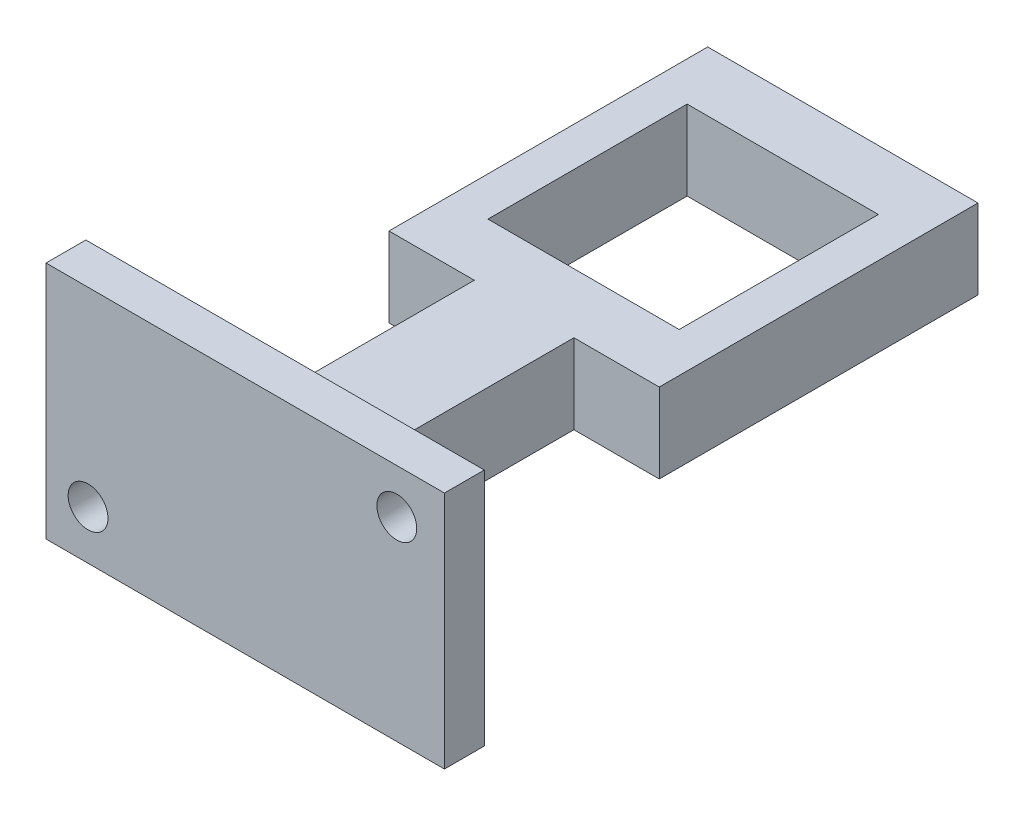
ISO-10303-21;
HEADER;
FILE_DESCRIPTION(('STEP AP214'),'2;1');
FILE_NAME('part.step','',(''),(''),'','','');
FILE_SCHEMA(('AUTOMOTIVE_DESIGN { 1 0 10303 214 1 1 1 1 }'));
ENDSEC;
DATA;
#1=APPLICATION_CONTEXT('core data for automotive mechanical design processes');
#2=APPLICATION_PROTOCOL_DEFINITION('international standard','automotive_design',2000,#1);
#3=PRODUCT_CONTEXT('',#1,'mechanical');
#4=PRODUCT('Part','Part','',(#3));
#5=PRODUCT_RELATED_PRODUCT_CATEGORY('part','',(#4));
#6=PRODUCT_DEFINITION_FORMATION('','',#4);
#7=PRODUCT_DEFINITION_CONTEXT('part definition',#1,'design');
#8=PRODUCT_DEFINITION('design','',#6,#7);
#9=PRODUCT_DEFINITION_SHAPE('','',#8);
#10=(LENGTH_UNIT() NAMED_UNIT(*) SI_UNIT(.MILLI.,.METRE.));
#11=(NAMED_UNIT(*) PLANE_ANGLE_UNIT() SI_UNIT($,.RADIAN.));
#12=(NAMED_UNIT(*) SI_UNIT($,.STERADIAN.) SOLID_ANGLE_UNIT());
#13=UNCERTAINTY_MEASURE_WITH_UNIT(LENGTH_MEASURE(1.E-05),#10,'distance_accuracy_value','');
#14=(GEOMETRIC_REPRESENTATION_CONTEXT(3) GLOBAL_UNCERTAINTY_ASSIGNED_CONTEXT((#13)) GLOBAL_UNIT_ASSIGNED_CONTEXT((#10,
#11,#12)) REPRESENTATION_CONTEXT('',''));
#15=CARTESIAN_POINT('',(0.,0.,0.));
#16=DIRECTION('',(0.,0.,1.));
#17=DIRECTION('',(1.,0.,0.));
#18=AXIS2_PLACEMENT_3D('',#15,#16,#17);
#19=CARTESIAN_POINT('',(0.,0.,0.));
#20=DIRECTION('',(0.,0.,-1.));
#21=DIRECTION('',(-1.,0.,0.));
#22=AXIS2_PLACEMENT_3D('',#19,#20,#21);
#23=PLANE('',#22);
#24=CARTESIAN_POINT('',(-19.7204584602484,-8.86343010030321,0.));
#25=DIRECTION('',(0.,0.,-1.));
#26=DIRECTION('',(-1.,0.,0.));
#27=AXIS2_PLACEMENT_3D('',#24,#25,#26);
#28=CIRCLE('',#27,2.5);
#29=CARTESIAN_POINT('',(-22.2204584602484,-8.86343010030321,0.));
#30=VERTEX_POINT('',#29);
#31=EDGE_CURVE('E287',#30,#30,#28,.T.);
#32=ORIENTED_EDGE('',*,*,#31,.F.);
#33=EDGE_LOOP('',(#32));
#34=FACE_BOUND('',#33,.T.);
#35=CARTESIAN_POINT('',(19.0200050176713,9.40224044074657,0.));
#36=DIRECTION('',(0.,0.,-1.));
#37=DIRECTION('',(-1.,0.,0.));
#38=AXIS2_PLACEMENT_3D('',#35,#36,#37);
#39=CIRCLE('',#38,2.5);
#40=CARTESIAN_POINT('',(16.5200050176713,9.40224044074657,0.));
#41=VERTEX_POINT('',#40);
#42=EDGE_CURVE('E176',#41,#41,#39,.T.);
#43=ORIENTED_EDGE('',*,*,#42,.F.);
#44=EDGE_LOOP('',(#43));
#45=FACE_BOUND('',#44,.T.);
#46=DIRECTION('',(0.,1.,0.));
#47=VECTOR('',#46,1.);
#48=CARTESIAN_POINT('',(25.,-15.,0.));
#49=LINE('',#48,#47);
#50=CARTESIAN_POINT('',(25.,-15.,0.));
#51=VERTEX_POINT('',#50);
#52=CARTESIAN_POINT('',(25.,15.,0.));
#53=VERTEX_POINT('',#52);
#54=EDGE_CURVE('E255',#51,#53,#49,.T.);
#55=ORIENTED_EDGE('',*,*,#54,.F.);
#56=DIRECTION('',(1.,0.,0.));
#57=VECTOR('',#56,1.);
#58=CARTESIAN_POINT('',(-25.,-15.,0.));
#59=LINE('',#58,#57);
#60=CARTESIAN_POINT('',(-25.,-15.,0.));
#61=VERTEX_POINT('',#60);
#62=EDGE_CURVE('E260',#61,#51,#59,.T.);
#63=ORIENTED_EDGE('',*,*,#62,.F.);
#64=DIRECTION('',(0.,-1.,0.));
#65=VECTOR('',#64,1.);
#66=CARTESIAN_POINT('',(-25.,-15.,0.));
#67=LINE('',#66,#65);
#68=CARTESIAN_POINT('',(-25.,15.,0.));
#69=VERTEX_POINT('',#68);
#70=EDGE_CURVE('E271',#69,#61,#67,.T.);
#71=ORIENTED_EDGE('',*,*,#70,.F.);
#72=DIRECTION('',(-1.,0.,0.));
#73=VECTOR('',#72,1.);
#74=CARTESIAN_POINT('',(-25.,15.,0.));
#75=LINE('',#74,#73);
#76=EDGE_CURVE('E269',#53,#69,#75,.T.);
#77=ORIENTED_EDGE('',*,*,#76,.F.);
#78=EDGE_LOOP('',(#55,#63,#71,#77));
#79=FACE_BOUND('',#78,.T.);
#80=DIRECTION('',(1.,0.,0.));
#81=VECTOR('',#80,1.);
#82=CARTESIAN_POINT('',(-6.25019994914977,-5.,0.));
#83=LINE('',#82,#81);
#84=CARTESIAN_POINT('',(-6.25019994914977,-5.,0.));
#85=VERTEX_POINT('',#84);
#86=CARTESIAN_POINT('',(6.25019994914977,-5.,0.));
#87=VERTEX_POINT('',#86);
#88=EDGE_CURVE('E226',#85,#87,#83,.T.);
#89=ORIENTED_EDGE('',*,*,#88,.T.);
#90=DIRECTION('',(0.,1.,0.));
#91=VECTOR('',#90,1.);
#92=CARTESIAN_POINT('',(6.25019994914977,-5.,0.));
#93=LINE('',#92,#91);
#94=CARTESIAN_POINT('',(6.25019994914977,5.,0.));
#95=VERTEX_POINT('',#94);
#96=EDGE_CURVE('E246',#87,#95,#93,.T.);
#97=ORIENTED_EDGE('',*,*,#96,.T.);
#98=DIRECTION('',(1.,0.,0.));
#99=VECTOR('',#98,1.);
#100=CARTESIAN_POINT('',(-6.25019994914977,5.,0.));
#101=LINE('',#100,#99);
#102=CARTESIAN_POINT('',(-6.25019994914977,5.,0.));
#103=VERTEX_POINT('',#102);
#104=EDGE_CURVE('E204',#103,#95,#101,.T.);
#105=ORIENTED_EDGE('',*,*,#104,.F.);
#106=DIRECTION('',(0.,1.,0.));
#107=VECTOR('',#106,1.);
#108=CARTESIAN_POINT('',(-6.25019994914977,-5.,0.));
#109=LINE('',#108,#107);
#110=EDGE_CURVE('E244',#85,#103,#109,.T.);
#111=ORIENTED_EDGE('',*,*,#110,.F.);
#112=EDGE_LOOP('',(#89,#97,#105,#111));
#113=FACE_BOUND('',#112,.T.);
#114=ADVANCED_FACE('F39',(#34,#45,#79,#113),#23,.T.);
#115=CARTESIAN_POINT('',(25.,-15.,5.));
#116=DIRECTION('',(-1.,0.,0.));
#117=DIRECTION('',(0.,0.,1.));
#118=AXIS2_PLACEMENT_3D('',#115,#116,#117);
#119=PLANE('',#118);
#120=ORIENTED_EDGE('',*,*,#54,.T.);
#121=DIRECTION('',(0.,0.,-1.));
#122=VECTOR('',#121,1.);
#123=CARTESIAN_POINT('',(25.,15.,5.));
#124=LINE('',#123,#122);
#125=CARTESIAN_POINT('',(25.,15.,5.));
#126=VERTEX_POINT('',#125);
#127=EDGE_CURVE('E11',#126,#53,#124,.T.);
#128=ORIENTED_EDGE('',*,*,#127,.F.);
#129=DIRECTION('',(0.,1.,0.));
#130=VECTOR('',#129,1.);
#131=CARTESIAN_POINT('',(25.,-15.,5.));
#132=LINE('',#131,#130);
#133=CARTESIAN_POINT('',(25.,-15.,5.));
#134=VERTEX_POINT('',#133);
#135=EDGE_CURVE('E256',#134,#126,#132,.T.);
#136=ORIENTED_EDGE('',*,*,#135,.F.);
#137=DIRECTION('',(0.,0.,-1.));
#138=VECTOR('',#137,1.);
#139=CARTESIAN_POINT('',(25.,-15.,5.));
#140=LINE('',#139,#138);
#141=EDGE_CURVE('E266',#134,#51,#140,.T.);
#142=ORIENTED_EDGE('',*,*,#141,.T.);
#143=EDGE_LOOP('',(#120,#128,#136,#142));
#144=FACE_BOUND('',#143,.T.);
#145=ADVANCED_FACE('F41',(#144),#119,.F.);
#146=CARTESIAN_POINT('',(-25.,15.,5.));
#147=DIRECTION('',(0.,-1.,0.));
#148=DIRECTION('',(0.,0.,-1.));
#149=AXIS2_PLACEMENT_3D('',#146,#147,#148);
#150=PLANE('',#149);
#151=ORIENTED_EDGE('',*,*,#76,.T.);
#152=DIRECTION('',(0.,0.,-1.));
#153=VECTOR('',#152,1.);
#154=CARTESIAN_POINT('',(-25.,15.,5.));
#155=LINE('',#154,#153);
#156=CARTESIAN_POINT('',(-25.,15.,5.));
#157=VERTEX_POINT('',#156);
#158=EDGE_CURVE('E48',#157,#69,#155,.T.);
#159=ORIENTED_EDGE('',*,*,#158,.F.);
#160=DIRECTION('',(-1.,0.,0.));
#161=VECTOR('',#160,1.);
#162=CARTESIAN_POINT('',(-25.,15.,5.));
#163=LINE('',#162,#161);
#164=EDGE_CURVE('E259',#126,#157,#163,.T.);
#165=ORIENTED_EDGE('',*,*,#164,.F.);
#166=ORIENTED_EDGE('',*,*,#127,.T.);
#167=EDGE_LOOP('',(#151,#159,#165,#166));
#168=FACE_BOUND('',#167,.T.);
#169=ADVANCED_FACE('F359',(#168),#150,.F.);
#170=CARTESIAN_POINT('',(-25.,-15.,5.));
#171=DIRECTION('',(1.,0.,0.));
#172=DIRECTION('',(0.,0.,-1.));
#173=AXIS2_PLACEMENT_3D('',#170,#171,#172);
#174=PLANE('',#173);
#175=ORIENTED_EDGE('',*,*,#70,.T.);
#176=DIRECTION('',(0.,0.,-1.));
#177=VECTOR('',#176,1.);
#178=CARTESIAN_POINT('',(-25.,-15.,5.));
#179=LINE('',#178,#177);
#180=CARTESIAN_POINT('',(-25.,-15.,5.));
#181=VERTEX_POINT('',#180);
#182=EDGE_CURVE('E276',#181,#61,#179,.T.);
#183=ORIENTED_EDGE('',*,*,#182,.F.);
#184=DIRECTION('',(0.,-1.,0.));
#185=VECTOR('',#184,1.);
#186=CARTESIAN_POINT('',(-25.,-15.,5.));
#187=LINE('',#186,#185);
#188=EDGE_CURVE('E262',#157,#181,#187,.T.);
#189=ORIENTED_EDGE('',*,*,#188,.F.);
#190=ORIENTED_EDGE('',*,*,#158,.T.);
#191=EDGE_LOOP('',(#175,#183,#189,#190));
#192=FACE_BOUND('',#191,.T.);
#193=ADVANCED_FACE('F356',(#192),#174,.F.);
#194=CARTESIAN_POINT('',(-25.,-15.,5.));
#195=DIRECTION('',(0.,1.,0.));
#196=DIRECTION('',(0.,0.,1.));
#197=AXIS2_PLACEMENT_3D('',#194,#195,#196);
#198=PLANE('',#197);
#199=ORIENTED_EDGE('',*,*,#62,.T.);
#200=ORIENTED_EDGE('',*,*,#141,.F.);
#201=DIRECTION('',(1.,0.,0.));
#202=VECTOR('',#201,1.);
#203=CARTESIAN_POINT('',(-25.,-15.,5.));
#204=LINE('',#203,#202);
#205=EDGE_CURVE('E264',#181,#134,#204,.T.);
#206=ORIENTED_EDGE('',*,*,#205,.F.);
#207=ORIENTED_EDGE('',*,*,#182,.T.);
#208=EDGE_LOOP('',(#199,#200,#206,#207));
#209=FACE_BOUND('',#208,.T.);
#210=ADVANCED_FACE('F352',(#209),#198,.F.);
#211=CARTESIAN_POINT('',(0.,0.,5.));
#212=DIRECTION('',(0.,0.,-1.));
#213=DIRECTION('',(-1.,0.,0.));
#214=AXIS2_PLACEMENT_3D('',#211,#212,#213);
#215=PLANE('',#214);
#216=CARTESIAN_POINT('',(-19.7204584602484,-8.86343010030321,5.));
#217=DIRECTION('',(0.,0.,-1.));
#218=DIRECTION('',(-1.,0.,0.));
#219=AXIS2_PLACEMENT_3D('',#216,#217,#218);
#220=CIRCLE('',#219,2.5);
#221=CARTESIAN_POINT('',(-22.2204584602484,-8.86343010030321,5.));
#222=VERTEX_POINT('',#221);
#223=EDGE_CURVE('E43',#222,#222,#220,.T.);
#224=ORIENTED_EDGE('',*,*,#223,.T.);
#225=EDGE_LOOP('',(#224));
#226=FACE_BOUND('',#225,.T.);
#227=CARTESIAN_POINT('',(19.0200050176713,9.40224044074657,5.));
#228=DIRECTION('',(0.,0.,-1.));
#229=DIRECTION('',(-1.,0.,0.));
#230=AXIS2_PLACEMENT_3D('',#227,#228,#229);
#231=CIRCLE('',#230,2.5);
#232=CARTESIAN_POINT('',(16.5200050176713,9.40224044074657,5.));
#233=VERTEX_POINT('',#232);
#234=EDGE_CURVE('E183',#233,#233,#231,.T.);
#235=ORIENTED_EDGE('',*,*,#234,.T.);
#236=EDGE_LOOP('',(#235));
#237=FACE_BOUND('',#236,.T.);
#238=ORIENTED_EDGE('',*,*,#135,.T.);
#239=ORIENTED_EDGE('',*,*,#164,.T.);
#240=ORIENTED_EDGE('',*,*,#188,.T.);
#241=ORIENTED_EDGE('',*,*,#205,.T.);
#242=EDGE_LOOP('',(#238,#239,#240,#241));
#243=FACE_BOUND('',#242,.T.);
#244=ADVANCED_FACE('F350',(#226,#237,#243),#215,.F.);
#245=CARTESIAN_POINT('',(-16.9588723492703,-5.,-70.));
#246=DIRECTION('',(0.,0.,1.));
#247=DIRECTION('',(1.,0.,0.));
#248=AXIS2_PLACEMENT_3D('',#245,#246,#247);
#249=PLANE('',#248);
#250=DIRECTION('',(0.,1.,0.));
#251=VECTOR('',#250,1.);
#252=CARTESIAN_POINT('',(-16.9588723492703,-5.,-70.));
#253=LINE('',#252,#251);
#254=CARTESIAN_POINT('',(-16.9588723492703,-5.,-70.));
#255=VERTEX_POINT('',#254);
#256=CARTESIAN_POINT('',(-16.9588723492703,5.,-70.));
#257=VERTEX_POINT('',#256);
#258=EDGE_CURVE('E238',#255,#257,#253,.T.);
#259=ORIENTED_EDGE('',*,*,#258,.T.);
#260=DIRECTION('',(1.,0.,0.));
#261=VECTOR('',#260,1.);
#262=CARTESIAN_POINT('',(-16.9588723492703,5.,-70.));
#263=LINE('',#262,#261);
#264=CARTESIAN_POINT('',(16.9588723492703,5.,-70.));
#265=VERTEX_POINT('',#264);
#266=EDGE_CURVE('E189',#257,#265,#263,.T.);
#267=ORIENTED_EDGE('',*,*,#266,.T.);
#268=DIRECTION('',(0.,1.,0.));
#269=VECTOR('',#268,1.);
#270=CARTESIAN_POINT('',(16.9588723492703,-5.,-70.));
#271=LINE('',#270,#269);
#272=CARTESIAN_POINT('',(16.9588723492703,-5.,-70.));
#273=VERTEX_POINT('',#272);
#274=EDGE_CURVE('E253',#273,#265,#271,.T.);
#275=ORIENTED_EDGE('',*,*,#274,.F.);
#276=DIRECTION('',(1.,0.,0.));
#277=VECTOR('',#276,1.);
#278=CARTESIAN_POINT('',(-16.9588723492703,-5.,-70.));
#279=LINE('',#278,#277);
#280=EDGE_CURVE('E215',#255,#273,#279,.T.);
#281=ORIENTED_EDGE('',*,*,#280,.F.);
#282=EDGE_LOOP('',(#259,#267,#275,#281));
#283=FACE_BOUND('',#282,.T.);
#284=ADVANCED_FACE('F327',(#283),#249,.F.);
#285=CARTESIAN_POINT('',(16.9588723492703,-5.,-70.));
#286=DIRECTION('',(-1.,0.,0.));
#287=DIRECTION('',(0.,0.,1.));
#288=AXIS2_PLACEMENT_3D('',#285,#286,#287);
#289=PLANE('',#288);
#290=ORIENTED_EDGE('',*,*,#274,.T.);
#291=DIRECTION('',(0.,0.,1.));
#292=VECTOR('',#291,1.);
#293=CARTESIAN_POINT('',(16.9588723492703,5.,-70.));
#294=LINE('',#293,#292);
#295=CARTESIAN_POINT('',(16.9588723492703,5.,-30.));
#296=VERTEX_POINT('',#295);
#297=EDGE_CURVE('E195',#265,#296,#294,.T.);
#298=ORIENTED_EDGE('',*,*,#297,.T.);
#299=DIRECTION('',(0.,1.,0.));
#300=VECTOR('',#299,1.);
#301=CARTESIAN_POINT('',(16.9588723492703,-5.,-30.));
#302=LINE('',#301,#300);
#303=CARTESIAN_POINT('',(16.9588723492703,-5.,-30.));
#304=VERTEX_POINT('',#303);
#305=EDGE_CURVE('E251',#304,#296,#302,.T.);
#306=ORIENTED_EDGE('',*,*,#305,.F.);
#307=DIRECTION('',(0.,0.,1.));
#308=VECTOR('',#307,1.);
#309=CARTESIAN_POINT('',(16.9588723492703,-5.,-70.));
#310=LINE('',#309,#308);
#311=EDGE_CURVE('E218',#273,#304,#310,.T.);
#312=ORIENTED_EDGE('',*,*,#311,.F.);
#313=EDGE_LOOP('',(#290,#298,#306,#312));
#314=FACE_BOUND('',#313,.T.);
#315=ADVANCED_FACE('F329',(#314),#289,.F.);
#316=CARTESIAN_POINT('',(6.25019994914976,-5.,-30.));
#317=DIRECTION('',(0.,0.,1.));
#318=DIRECTION('',(1.,0.,0.));
#319=AXIS2_PLACEMENT_3D('',#316,#317,#318);
#320=PLANE('',#319);
#321=ORIENTED_EDGE('',*,*,#305,.T.);
#322=DIRECTION('',(1.,0.,0.));
#323=VECTOR('',#322,1.);
#324=CARTESIAN_POINT('',(6.25019994914976,5.,-30.));
#325=LINE('',#324,#323);
#326=CARTESIAN_POINT('',(6.25019994914976,5.,-30.));
#327=VERTEX_POINT('',#326);
#328=EDGE_CURVE('E198',#327,#296,#325,.T.);
#329=ORIENTED_EDGE('',*,*,#328,.F.);
#330=DIRECTION('',(0.,1.,0.));
#331=VECTOR('',#330,1.);
#332=CARTESIAN_POINT('',(6.25019994914976,-5.,-30.));
#333=LINE('',#332,#331);
#334=CARTESIAN_POINT('',(6.25019994914976,-5.,-30.));
#335=VERTEX_POINT('',#334);
#336=EDGE_CURVE('E249',#335,#327,#333,.T.);
#337=ORIENTED_EDGE('',*,*,#336,.F.);
#338=DIRECTION('',(1.,0.,0.));
#339=VECTOR('',#338,1.);
#340=CARTESIAN_POINT('',(6.25019994914976,-5.,-30.));
#341=LINE('',#340,#339);
#342=EDGE_CURVE('E220',#335,#304,#341,.T.);
#343=ORIENTED_EDGE('',*,*,#342,.T.);
#344=EDGE_LOOP('',(#321,#329,#337,#343));
#345=FACE_BOUND('',#344,.T.);
#346=ADVANCED_FACE('F333',(#345),#320,.T.);
#347=CARTESIAN_POINT('',(6.25019994914976,-5.,-30.));
#348=DIRECTION('',(-1.,0.,0.));
#349=DIRECTION('',(0.,0.,1.));
#350=AXIS2_PLACEMENT_3D('',#347,#348,#349);
#351=PLANE('',#350);
#352=ORIENTED_EDGE('',*,*,#336,.T.);
#353=DIRECTION('',(0.,0.,1.));
#354=VECTOR('',#353,1.);
#355=CARTESIAN_POINT('',(6.25019994914976,5.,-30.));
#356=LINE('',#355,#354);
#357=EDGE_CURVE('E201',#327,#95,#356,.T.);
#358=ORIENTED_EDGE('',*,*,#357,.T.);
#359=ORIENTED_EDGE('',*,*,#96,.F.);
#360=DIRECTION('',(0.,0.,1.));
#361=VECTOR('',#360,1.);
#362=CARTESIAN_POINT('',(6.25019994914976,-5.,-30.));
#363=LINE('',#362,#361);
#364=EDGE_CURVE('E223',#335,#87,#363,.T.);
#365=ORIENTED_EDGE('',*,*,#364,.F.);
#366=EDGE_LOOP('',(#352,#358,#359,#365));
#367=FACE_BOUND('',#366,.T.);
#368=ADVANCED_FACE('F335',(#367),#351,.F.);
#369=CARTESIAN_POINT('',(-6.25019994914977,-5.,-30.));
#370=DIRECTION('',(-1.,0.,0.));
#371=DIRECTION('',(0.,0.,1.));
#372=AXIS2_PLACEMENT_3D('',#369,#370,#371);
#373=PLANE('',#372);
#374=ORIENTED_EDGE('',*,*,#110,.T.);
#375=DIRECTION('',(0.,0.,1.));
#376=VECTOR('',#375,1.);
#377=CARTESIAN_POINT('',(-6.25019994914977,5.,-30.));
#378=LINE('',#377,#376);
#379=CARTESIAN_POINT('',(-6.25019994914977,5.,-30.));
#380=VERTEX_POINT('',#379);
#381=EDGE_CURVE('E206',#380,#103,#378,.T.);
#382=ORIENTED_EDGE('',*,*,#381,.F.);
#383=DIRECTION('',(0.,1.,0.));
#384=VECTOR('',#383,1.);
#385=CARTESIAN_POINT('',(-6.25019994914977,-5.,-30.));
#386=LINE('',#385,#384);
#387=CARTESIAN_POINT('',(-6.25019994914977,-5.,-30.));
#388=VERTEX_POINT('',#387);
#389=EDGE_CURVE('E242',#388,#380,#386,.T.);
#390=ORIENTED_EDGE('',*,*,#389,.F.);
#391=DIRECTION('',(0.,0.,1.));
#392=VECTOR('',#391,1.);
#393=CARTESIAN_POINT('',(-6.25019994914977,-5.,-30.));
#394=LINE('',#393,#392);
#395=EDGE_CURVE('E229',#388,#85,#394,.T.);
#396=ORIENTED_EDGE('',*,*,#395,.T.);
#397=EDGE_LOOP('',(#374,#382,#390,#396));
#398=FACE_BOUND('',#397,.T.);
#399=ADVANCED_FACE('F310',(#398),#373,.T.);
#400=CARTESIAN_POINT('',(-16.9588723492703,-5.,-30.));
#401=DIRECTION('',(0.,0.,1.));
#402=DIRECTION('',(1.,0.,0.));
#403=AXIS2_PLACEMENT_3D('',#400,#401,#402);
#404=PLANE('',#403);
#405=ORIENTED_EDGE('',*,*,#389,.T.);
#406=DIRECTION('',(1.,0.,0.));
#407=VECTOR('',#406,1.);
#408=CARTESIAN_POINT('',(-16.9588723492703,5.,-30.));
#409=LINE('',#408,#407);
#410=CARTESIAN_POINT('',(-16.9588723492703,5.,-30.));
#411=VERTEX_POINT('',#410);
#412=EDGE_CURVE('E209',#411,#380,#409,.T.);
#413=ORIENTED_EDGE('',*,*,#412,.F.);
#414=DIRECTION('',(0.,1.,0.));
#415=VECTOR('',#414,1.);
#416=CARTESIAN_POINT('',(-16.9588723492703,-5.,-30.));
#417=LINE('',#416,#415);
#418=CARTESIAN_POINT('',(-16.9588723492703,-5.,-30.));
#419=VERTEX_POINT('',#418);
#420=EDGE_CURVE('E240',#419,#411,#417,.T.);
#421=ORIENTED_EDGE('',*,*,#420,.F.);
#422=DIRECTION('',(1.,0.,0.));
#423=VECTOR('',#422,1.);
#424=CARTESIAN_POINT('',(-16.9588723492703,-5.,-30.));
#425=LINE('',#424,#423);
#426=EDGE_CURVE('E232',#419,#388,#425,.T.);
#427=ORIENTED_EDGE('',*,*,#426,.T.);
#428=EDGE_LOOP('',(#405,#413,#421,#427));
#429=FACE_BOUND('',#428,.T.);
#430=ADVANCED_FACE('F314',(#429),#404,.T.);
#431=CARTESIAN_POINT('',(-16.9588723492703,-5.,-70.));
#432=DIRECTION('',(-1.,0.,0.));
#433=DIRECTION('',(0.,0.,1.));
#434=AXIS2_PLACEMENT_3D('',#431,#432,#433);
#435=PLANE('',#434);
#436=ORIENTED_EDGE('',*,*,#420,.T.);
#437=DIRECTION('',(0.,0.,1.));
#438=VECTOR('',#437,1.);
#439=CARTESIAN_POINT('',(-16.9588723492703,5.,-70.));
#440=LINE('',#439,#438);
#441=EDGE_CURVE('E212',#257,#411,#440,.T.);
#442=ORIENTED_EDGE('',*,*,#441,.F.);
#443=ORIENTED_EDGE('',*,*,#258,.F.);
#444=DIRECTION('',(0.,0.,1.));
#445=VECTOR('',#444,1.);
#446=CARTESIAN_POINT('',(-16.9588723492703,-5.,-70.));
#447=LINE('',#446,#445);
#448=EDGE_CURVE('E235',#255,#419,#447,.T.);
#449=ORIENTED_EDGE('',*,*,#448,.T.);
#450=EDGE_LOOP('',(#436,#442,#443,#449));
#451=FACE_BOUND('',#450,.T.);
#452=ADVANCED_FACE('F321',(#451),#435,.T.);
#453=CARTESIAN_POINT('',(0.,-5.,0.));
#454=DIRECTION('',(0.,-1.,0.));
#455=DIRECTION('',(0.,0.,-1.));
#456=AXIS2_PLACEMENT_3D('',#453,#454,#455);
#457=PLANE('',#456);
#458=DIRECTION('',(1.,0.,0.));
#459=VECTOR('',#458,1.);
#460=CARTESIAN_POINT('',(-12.0411276507297,-5.,-37.5));
#461=LINE('',#460,#459);
#462=CARTESIAN_POINT('',(-12.0411276507297,-5.,-37.5));
#463=VERTEX_POINT('',#462);
#464=CARTESIAN_POINT('',(11.9588723492703,-5.,-37.5));
#465=VERTEX_POINT('',#464);
#466=EDGE_CURVE('E156',#463,#465,#461,.T.);
#467=ORIENTED_EDGE('',*,*,#466,.T.);
#468=DIRECTION('',(0.,0.,-1.));
#469=VECTOR('',#468,1.);
#470=CARTESIAN_POINT('',(11.9588723492703,-5.,-37.5));
#471=LINE('',#470,#469);
#472=CARTESIAN_POINT('',(11.9588723492703,-5.,-62.5));
#473=VERTEX_POINT('',#472);
#474=EDGE_CURVE('E162',#465,#473,#471,.T.);
#475=ORIENTED_EDGE('',*,*,#474,.T.);
#476=DIRECTION('',(1.,0.,0.));
#477=VECTOR('',#476,1.);
#478=CARTESIAN_POINT('',(-12.0411276507297,-5.,-62.5));
#479=LINE('',#478,#477);
#480=CARTESIAN_POINT('',(-12.0411276507297,-5.,-62.5));
#481=VERTEX_POINT('',#480);
#482=EDGE_CURVE('E166',#481,#473,#479,.T.);
#483=ORIENTED_EDGE('',*,*,#482,.F.);
#484=DIRECTION('',(0.,0.,-1.));
#485=VECTOR('',#484,1.);
#486=CARTESIAN_POINT('',(-12.0411276507297,-5.,-37.5));
#487=LINE('',#486,#485);
#488=EDGE_CURVE('E159',#463,#481,#487,.T.);
#489=ORIENTED_EDGE('',*,*,#488,.F.);
#490=EDGE_LOOP('',(#467,#475,#483,#489));
#491=FACE_BOUND('',#490,.T.);
#492=ORIENTED_EDGE('',*,*,#280,.T.);
#493=ORIENTED_EDGE('',*,*,#311,.T.);
#494=ORIENTED_EDGE('',*,*,#342,.F.);
#495=ORIENTED_EDGE('',*,*,#364,.T.);
#496=ORIENTED_EDGE('',*,*,#88,.F.);
#497=ORIENTED_EDGE('',*,*,#395,.F.);
#498=ORIENTED_EDGE('',*,*,#426,.F.);
#499=ORIENTED_EDGE('',*,*,#448,.F.);
#500=EDGE_LOOP('',(#492,#493,#494,#495,#496,#497,#498,#499));
#501=FACE_BOUND('',#500,.T.);
#502=ADVANCED_FACE('F168',(#491,#501),#457,.T.);
#503=CARTESIAN_POINT('',(0.,5.,0.));
#504=DIRECTION('',(0.,-1.,0.));
#505=DIRECTION('',(0.,0.,-1.));
#506=AXIS2_PLACEMENT_3D('',#503,#504,#505);
#507=PLANE('',#506);
#508=DIRECTION('',(0.,0.,-1.));
#509=VECTOR('',#508,1.);
#510=CARTESIAN_POINT('',(11.9588723492703,5.,-37.5));
#511=LINE('',#510,#509);
#512=CARTESIAN_POINT('',(11.9588723492703,5.,-37.5));
#513=VERTEX_POINT('',#512);
#514=CARTESIAN_POINT('',(11.9588723492703,5.,-62.5));
#515=VERTEX_POINT('',#514);
#516=EDGE_CURVE('E182',#513,#515,#511,.T.);
#517=ORIENTED_EDGE('',*,*,#516,.F.);
#518=DIRECTION('',(1.,0.,0.));
#519=VECTOR('',#518,1.);
#520=CARTESIAN_POINT('',(-12.0411276507297,5.,-37.5));
#521=LINE('',#520,#519);
#522=CARTESIAN_POINT('',(-12.0411276507297,5.,-37.5));
#523=VERTEX_POINT('',#522);
#524=EDGE_CURVE('E64',#523,#513,#521,.T.);
#525=ORIENTED_EDGE('',*,*,#524,.F.);
#526=DIRECTION('',(0.,0.,-1.));
#527=VECTOR('',#526,1.);
#528=CARTESIAN_POINT('',(-12.0411276507297,5.,-37.5));
#529=LINE('',#528,#527);
#530=CARTESIAN_POINT('',(-12.0411276507297,5.,-62.5));
#531=VERTEX_POINT('',#530);
#532=EDGE_CURVE('E170',#523,#531,#529,.T.);
#533=ORIENTED_EDGE('',*,*,#532,.T.);
#534=DIRECTION('',(1.,0.,0.));
#535=VECTOR('',#534,1.);
#536=CARTESIAN_POINT('',(-12.0411276507297,5.,-62.5));
#537=LINE('',#536,#535);
#538=EDGE_CURVE('E173',#531,#515,#537,.T.);
#539=ORIENTED_EDGE('',*,*,#538,.T.);
#540=EDGE_LOOP('',(#517,#525,#533,#539));
#541=FACE_BOUND('',#540,.T.);
#542=ORIENTED_EDGE('',*,*,#266,.F.);
#543=ORIENTED_EDGE('',*,*,#441,.T.);
#544=ORIENTED_EDGE('',*,*,#412,.T.);
#545=ORIENTED_EDGE('',*,*,#381,.T.);
#546=ORIENTED_EDGE('',*,*,#104,.T.);
#547=ORIENTED_EDGE('',*,*,#357,.F.);
#548=ORIENTED_EDGE('',*,*,#328,.T.);
#549=ORIENTED_EDGE('',*,*,#297,.F.);
#550=EDGE_LOOP('',(#542,#543,#544,#545,#546,#547,#548,#549));
#551=FACE_BOUND('',#550,.T.);
#552=ADVANCED_FACE('F317',(#541,#551),#507,.F.);
#553=CARTESIAN_POINT('',(-12.0411276507297,-5.,-37.5));
#554=DIRECTION('',(0.,0.,1.));
#555=DIRECTION('',(1.,0.,0.));
#556=AXIS2_PLACEMENT_3D('',#553,#554,#555);
#557=PLANE('',#556);
#558=ORIENTED_EDGE('',*,*,#524,.T.);
#559=DIRECTION('',(0.,1.,0.));
#560=VECTOR('',#559,1.);
#561=CARTESIAN_POINT('',(11.9588723492703,-5.,-37.5));
#562=LINE('',#561,#560);
#563=EDGE_CURVE('E153',#465,#513,#562,.T.);
#564=ORIENTED_EDGE('',*,*,#563,.F.);
#565=ORIENTED_EDGE('',*,*,#466,.F.);
#566=DIRECTION('',(0.,1.,0.));
#567=VECTOR('',#566,1.);
#568=CARTESIAN_POINT('',(-12.0411276507297,-5.,-37.5));
#569=LINE('',#568,#567);
#570=EDGE_CURVE('E187',#463,#523,#569,.T.);
#571=ORIENTED_EDGE('',*,*,#570,.T.);
#572=EDGE_LOOP('',(#558,#564,#565,#571));
#573=FACE_BOUND('',#572,.T.);
#574=ADVANCED_FACE('F154',(#573),#557,.F.);
#575=CARTESIAN_POINT('',(-12.0411276507297,-5.,-37.5));
#576=DIRECTION('',(1.,0.,0.));
#577=DIRECTION('',(0.,0.,-1.));
#578=AXIS2_PLACEMENT_3D('',#575,#576,#577);
#579=PLANE('',#578);
#580=ORIENTED_EDGE('',*,*,#532,.F.);
#581=ORIENTED_EDGE('',*,*,#570,.F.);
#582=ORIENTED_EDGE('',*,*,#488,.T.);
#583=DIRECTION('',(0.,1.,0.));
#584=VECTOR('',#583,1.);
#585=CARTESIAN_POINT('',(-12.0411276507297,-5.,-62.5));
#586=LINE('',#585,#584);
#587=EDGE_CURVE('E190',#481,#531,#586,.T.);
#588=ORIENTED_EDGE('',*,*,#587,.T.);
#589=EDGE_LOOP('',(#580,#581,#582,#588));
#590=FACE_BOUND('',#589,.T.);
#591=ADVANCED_FACE('F422',(#590),#579,.T.);
#592=CARTESIAN_POINT('',(-12.0411276507297,-5.,-62.5));
#593=DIRECTION('',(0.,0.,1.));
#594=DIRECTION('',(1.,0.,0.));
#595=AXIS2_PLACEMENT_3D('',#592,#593,#594);
#596=PLANE('',#595);
#597=ORIENTED_EDGE('',*,*,#538,.F.);
#598=ORIENTED_EDGE('',*,*,#587,.F.);
#599=ORIENTED_EDGE('',*,*,#482,.T.);
#600=DIRECTION('',(0.,1.,0.));
#601=VECTOR('',#600,1.);
#602=CARTESIAN_POINT('',(11.9588723492703,-5.,-62.5));
#603=LINE('',#602,#601);
#604=EDGE_CURVE('E56',#473,#515,#603,.T.);
#605=ORIENTED_EDGE('',*,*,#604,.T.);
#606=EDGE_LOOP('',(#597,#598,#599,#605));
#607=FACE_BOUND('',#606,.T.);
#608=ADVANCED_FACE('F415',(#607),#596,.T.);
#609=CARTESIAN_POINT('',(11.9588723492703,-5.,-37.5));
#610=DIRECTION('',(1.,0.,0.));
#611=DIRECTION('',(0.,0.,-1.));
#612=AXIS2_PLACEMENT_3D('',#609,#610,#611);
#613=PLANE('',#612);
#614=ORIENTED_EDGE('',*,*,#516,.T.);
#615=ORIENTED_EDGE('',*,*,#604,.F.);
#616=ORIENTED_EDGE('',*,*,#474,.F.);
#617=ORIENTED_EDGE('',*,*,#563,.T.);
#618=EDGE_LOOP('',(#614,#615,#616,#617));
#619=FACE_BOUND('',#618,.T.);
#620=ADVANCED_FACE('F163',(#619),#613,.F.);
#621=CARTESIAN_POINT('',(19.0200050176713,9.40224044074657,10.));
#622=DIRECTION('',(0.,0.,-1.));
#623=DIRECTION('',(-1.,0.,0.));
#624=AXIS2_PLACEMENT_3D('',#621,#622,#623);
#625=CYLINDRICAL_SURFACE('',#624,2.5);
#626=ORIENTED_EDGE('',*,*,#42,.T.);
#627=EDGE_LOOP('',(#626));
#628=FACE_BOUND('',#627,.T.);
#629=ORIENTED_EDGE('',*,*,#234,.F.);
#630=EDGE_LOOP('',(#629));
#631=FACE_BOUND('',#630,.T.);
#632=ADVANCED_FACE('F390',(#628,#631),#625,.F.);
#633=CARTESIAN_POINT('',(-19.7204584602484,-8.86343010030321,10.));
#634=DIRECTION('',(0.,0.,-1.));
#635=DIRECTION('',(-1.,0.,0.));
#636=AXIS2_PLACEMENT_3D('',#633,#634,#635);
#637=CYLINDRICAL_SURFACE('',#636,2.5);
#638=ORIENTED_EDGE('',*,*,#31,.T.);
#639=EDGE_LOOP('',(#638));
#640=FACE_BOUND('',#639,.T.);
#641=ORIENTED_EDGE('',*,*,#223,.F.);
#642=EDGE_LOOP('',(#641));
#643=FACE_BOUND('',#642,.T.);
#644=ADVANCED_FACE('F293',(#640,#643),#637,.F.);
#645=CLOSED_SHELL('',(#114,#145,#169,#193,#210,#244,#284,#315,#346,#368,#399,#430,#452,#502,
#552,#574,#591,#608,#620,#632,#644));
#646=MANIFOLD_SOLID_BREP('B2',#645);
#647=ADVANCED_BREP_SHAPE_REPRESENTATION('',(#18,#646),#14);
#648=SHAPE_DEFINITION_REPRESENTATION(#9,#647);
ENDSEC;
END-ISO-10303-21;
